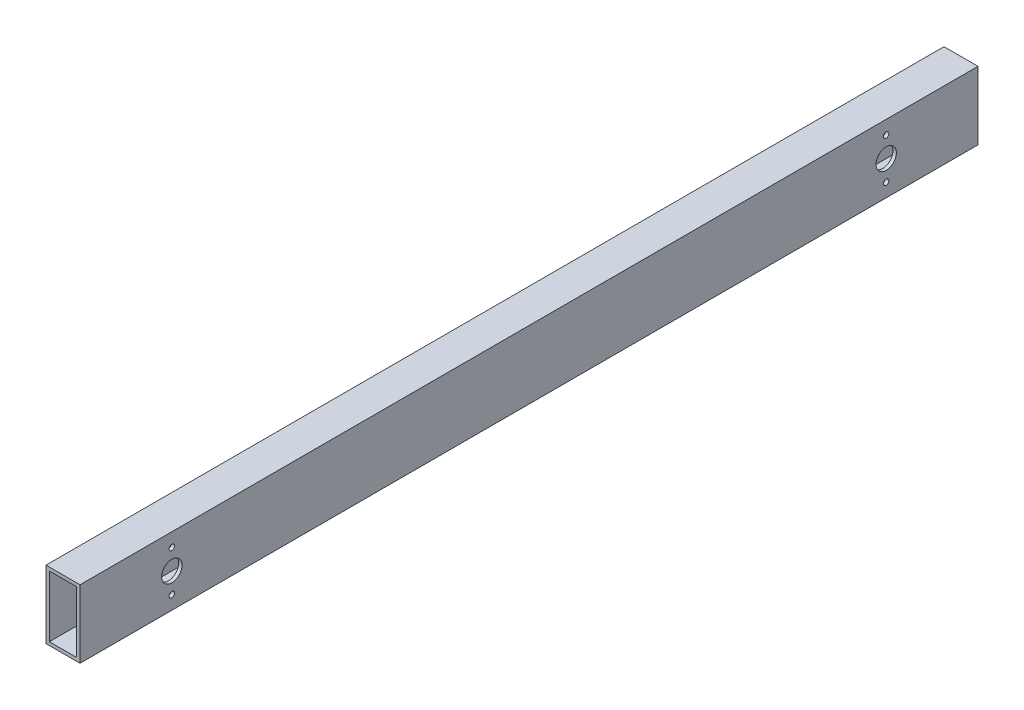
ISO-10303-21;
HEADER;
FILE_DESCRIPTION(('STEP AP214'),'2;1');
FILE_NAME('part.step','',(''),(''),'','','');
FILE_SCHEMA(('AUTOMOTIVE_DESIGN { 1 0 10303 214 1 1 1 1 }'));
ENDSEC;
DATA;
#1=APPLICATION_CONTEXT('core data for automotive mechanical design processes');
#2=APPLICATION_PROTOCOL_DEFINITION('international standard','automotive_design',2000,#1);
#3=PRODUCT_CONTEXT('',#1,'mechanical');
#4=PRODUCT('Part','Part','',(#3));
#5=PRODUCT_RELATED_PRODUCT_CATEGORY('part','',(#4));
#6=PRODUCT_DEFINITION_FORMATION('','',#4);
#7=PRODUCT_DEFINITION_CONTEXT('part definition',#1,'design');
#8=PRODUCT_DEFINITION('design','',#6,#7);
#9=PRODUCT_DEFINITION_SHAPE('','',#8);
#10=(LENGTH_UNIT() NAMED_UNIT(*) SI_UNIT(.MILLI.,.METRE.));
#11=(NAMED_UNIT(*) PLANE_ANGLE_UNIT() SI_UNIT($,.RADIAN.));
#12=(NAMED_UNIT(*) SI_UNIT($,.STERADIAN.) SOLID_ANGLE_UNIT());
#13=UNCERTAINTY_MEASURE_WITH_UNIT(LENGTH_MEASURE(1.E-05),#10,'distance_accuracy_value','');
#14=(GEOMETRIC_REPRESENTATION_CONTEXT(3) GLOBAL_UNCERTAINTY_ASSIGNED_CONTEXT((#13)) GLOBAL_UNIT_ASSIGNED_CONTEXT((#10,
#11,#12)) REPRESENTATION_CONTEXT('',''));
#15=CARTESIAN_POINT('',(0.,0.,0.));
#16=DIRECTION('',(0.,0.,1.));
#17=DIRECTION('',(1.,0.,0.));
#18=AXIS2_PLACEMENT_3D('',#15,#16,#17);
#19=CARTESIAN_POINT('',(-12.1647272806195,2.51031979037716,838.2));
#20=DIRECTION('',(1.,0.,0.));
#21=DIRECTION('',(0.,1.,0.));
#22=AXIS2_PLACEMENT_3D('',#19,#20,#21);
#23=PLANE('',#22);
#24=CARTESIAN_POINT('',(-12.1647272806195,-10.1896802096228,752.475));
#25=DIRECTION('',(1.,0.,0.));
#26=DIRECTION('',(0.,1.,0.));
#27=AXIS2_PLACEMENT_3D('',#24,#25,#26);
#28=CIRCLE('',#27,2.53999999999996);
#29=CARTESIAN_POINT('',(-12.1647272806195,-7.64968020962289,752.475));
#30=VERTEX_POINT('',#29);
#31=EDGE_CURVE('E272',#30,#30,#28,.F.);
#32=ORIENTED_EDGE('',*,*,#31,.F.);
#33=EDGE_LOOP('',(#32));
#34=FACE_BOUND('',#33,.T.);
#35=CARTESIAN_POINT('',(-12.1647272806195,-48.2896802096228,752.475));
#36=DIRECTION('',(1.,0.,0.));
#37=DIRECTION('',(0.,1.,0.));
#38=AXIS2_PLACEMENT_3D('',#35,#36,#37);
#39=CIRCLE('',#38,2.53999999999995);
#40=CARTESIAN_POINT('',(-12.1647272806195,-45.7496802096229,752.475));
#41=VERTEX_POINT('',#40);
#42=EDGE_CURVE('E229',#41,#41,#39,.F.);
#43=ORIENTED_EDGE('',*,*,#42,.F.);
#44=EDGE_LOOP('',(#43));
#45=FACE_BOUND('',#44,.T.);
#46=CARTESIAN_POINT('',(-12.1647272806195,-29.2396802096228,752.475));
#47=DIRECTION('',(1.,0.,0.));
#48=DIRECTION('',(0.,1.,0.));
#49=AXIS2_PLACEMENT_3D('',#46,#47,#48);
#50=CIRCLE('',#49,9.52500000000002);
#51=CARTESIAN_POINT('',(-12.1647272806195,-19.7146802096228,752.475));
#52=VERTEX_POINT('',#51);
#53=EDGE_CURVE('E169',#52,#52,#50,.F.);
#54=ORIENTED_EDGE('',*,*,#53,.F.);
#55=EDGE_LOOP('',(#54));
#56=FACE_BOUND('',#55,.T.);
#57=DIRECTION('',(0.,-1.,0.));
#58=VECTOR('',#57,1.);
#59=CARTESIAN_POINT('',(-12.1647272806195,2.51031979037716,0.));
#60=LINE('',#59,#58);
#61=CARTESIAN_POINT('',(-12.1647272806195,2.51031979037716,0.));
#62=VERTEX_POINT('',#61);
#63=CARTESIAN_POINT('',(-12.1647272806195,-60.9896802096228,0.));
#64=VERTEX_POINT('',#63);
#65=EDGE_CURVE('E117',#62,#64,#60,.T.);
#66=ORIENTED_EDGE('',*,*,#65,.T.);
#67=DIRECTION('',(0.,0.,-1.));
#68=VECTOR('',#67,1.);
#69=CARTESIAN_POINT('',(-12.1647272806195,-60.9896802096228,838.2));
#70=LINE('',#69,#68);
#71=CARTESIAN_POINT('',(-12.1647272806195,-60.9896802096228,838.2));
#72=VERTEX_POINT('',#71);
#73=EDGE_CURVE('E11',#72,#64,#70,.T.);
#74=ORIENTED_EDGE('',*,*,#73,.F.);
#75=DIRECTION('',(0.,-1.,0.));
#76=VECTOR('',#75,1.);
#77=CARTESIAN_POINT('',(-12.1647272806195,2.51031979037716,838.2));
#78=LINE('',#77,#76);
#79=CARTESIAN_POINT('',(-12.1647272806195,2.51031979037716,838.2));
#80=VERTEX_POINT('',#79);
#81=EDGE_CURVE('E140',#80,#72,#78,.T.);
#82=ORIENTED_EDGE('',*,*,#81,.F.);
#83=DIRECTION('',(0.,0.,-1.));
#84=VECTOR('',#83,1.);
#85=CARTESIAN_POINT('',(-12.1647272806195,2.51031979037716,838.2));
#86=LINE('',#85,#84);
#87=EDGE_CURVE('E150',#80,#62,#86,.T.);
#88=ORIENTED_EDGE('',*,*,#87,.T.);
#89=EDGE_LOOP('',(#66,#74,#82,#88));
#90=FACE_BOUND('',#89,.T.);
#91=CARTESIAN_POINT('',(-12.1647272806195,-48.2896802096228,85.7249999999999));
#92=DIRECTION('',(1.,0.,0.));
#93=DIRECTION('',(0.,1.,0.));
#94=AXIS2_PLACEMENT_3D('',#91,#92,#93);
#95=CIRCLE('',#94,2.53999999999995);
#96=CARTESIAN_POINT('',(-12.1647272806195,-45.7496802096228,85.7249999999999));
#97=VERTEX_POINT('',#96);
#98=EDGE_CURVE('E266',#97,#97,#95,.T.);
#99=ORIENTED_EDGE('',*,*,#98,.T.);
#100=EDGE_LOOP('',(#99));
#101=FACE_BOUND('',#100,.T.);
#102=CARTESIAN_POINT('',(-12.1647272806195,-29.2396802096228,85.7249999999999));
#103=DIRECTION('',(1.,0.,0.));
#104=DIRECTION('',(0.,1.,0.));
#105=AXIS2_PLACEMENT_3D('',#102,#103,#104);
#106=CIRCLE('',#105,9.52500000000002);
#107=CARTESIAN_POINT('',(-12.1647272806195,-19.7146802096227,85.7249999999999));
#108=VERTEX_POINT('',#107);
#109=EDGE_CURVE('E240',#108,#108,#106,.T.);
#110=ORIENTED_EDGE('',*,*,#109,.T.);
#111=EDGE_LOOP('',(#110));
#112=FACE_BOUND('',#111,.T.);
#113=CARTESIAN_POINT('',(-12.1647272806195,-10.1896802096228,85.7249999999999));
#114=DIRECTION('',(1.,0.,0.));
#115=DIRECTION('',(0.,1.,0.));
#116=AXIS2_PLACEMENT_3D('',#113,#114,#115);
#117=CIRCLE('',#116,2.53999999999995);
#118=CARTESIAN_POINT('',(-12.1647272806195,-7.64968020962281,85.7249999999999));
#119=VERTEX_POINT('',#118);
#120=EDGE_CURVE('E230',#119,#119,#117,.T.);
#121=ORIENTED_EDGE('',*,*,#120,.T.);
#122=EDGE_LOOP('',(#121));
#123=FACE_BOUND('',#122,.T.);
#124=ADVANCED_FACE('F34',(#34,#45,#56,#90,#101,#112,#123),#23,.F.);
#125=CARTESIAN_POINT('',(19.5852727193805,2.51031979037716,838.2));
#126=DIRECTION('',(-1.,0.,0.));
#127=DIRECTION('',(0.,-1.,0.));
#128=AXIS2_PLACEMENT_3D('',#125,#126,#127);
#129=PLANE('',#128);
#130=CARTESIAN_POINT('',(19.5852727193805,-10.1896802096228,752.475));
#131=DIRECTION('',(1.,0.,0.));
#132=DIRECTION('',(0.,1.,0.));
#133=AXIS2_PLACEMENT_3D('',#130,#131,#132);
#134=CIRCLE('',#133,2.53999999999996);
#135=CARTESIAN_POINT('',(19.5852727193805,-7.64968020962288,752.475));
#136=VERTEX_POINT('',#135);
#137=EDGE_CURVE('E249',#136,#136,#134,.T.);
#138=ORIENTED_EDGE('',*,*,#137,.F.);
#139=EDGE_LOOP('',(#138));
#140=FACE_BOUND('',#139,.T.);
#141=CARTESIAN_POINT('',(19.5852727193805,-48.2896802096228,752.475));
#142=DIRECTION('',(1.,0.,0.));
#143=DIRECTION('',(0.,1.,0.));
#144=AXIS2_PLACEMENT_3D('',#141,#142,#143);
#145=CIRCLE('',#144,2.53999999999995);
#146=CARTESIAN_POINT('',(19.5852727193805,-45.7496802096229,752.475));
#147=VERTEX_POINT('',#146);
#148=EDGE_CURVE('E233',#147,#147,#145,.T.);
#149=ORIENTED_EDGE('',*,*,#148,.F.);
#150=EDGE_LOOP('',(#149));
#151=FACE_BOUND('',#150,.T.);
#152=CARTESIAN_POINT('',(19.5852727193805,-29.2396802096228,752.475));
#153=DIRECTION('',(1.,0.,0.));
#154=DIRECTION('',(0.,1.,0.));
#155=AXIS2_PLACEMENT_3D('',#152,#153,#154);
#156=CIRCLE('',#155,9.52500000000002);
#157=CARTESIAN_POINT('',(19.5852727193805,-19.7146802096228,752.475));
#158=VERTEX_POINT('',#157);
#159=EDGE_CURVE('E246',#158,#158,#156,.T.);
#160=ORIENTED_EDGE('',*,*,#159,.F.);
#161=EDGE_LOOP('',(#160));
#162=FACE_BOUND('',#161,.T.);
#163=DIRECTION('',(0.,1.,0.));
#164=VECTOR('',#163,1.);
#165=CARTESIAN_POINT('',(19.5852727193805,2.51031979037716,0.));
#166=LINE('',#165,#164);
#167=CARTESIAN_POINT('',(19.5852727193805,-60.9896802096228,0.));
#168=VERTEX_POINT('',#167);
#169=CARTESIAN_POINT('',(19.5852727193805,2.51031979037716,0.));
#170=VERTEX_POINT('',#169);
#171=EDGE_CURVE('E155',#168,#170,#166,.T.);
#172=ORIENTED_EDGE('',*,*,#171,.T.);
#173=DIRECTION('',(0.,0.,-1.));
#174=VECTOR('',#173,1.);
#175=CARTESIAN_POINT('',(19.5852727193805,2.51031979037716,838.2));
#176=LINE('',#175,#174);
#177=CARTESIAN_POINT('',(19.5852727193805,2.51031979037716,838.2));
#178=VERTEX_POINT('',#177);
#179=EDGE_CURVE('E160',#178,#170,#176,.T.);
#180=ORIENTED_EDGE('',*,*,#179,.F.);
#181=DIRECTION('',(0.,1.,0.));
#182=VECTOR('',#181,1.);
#183=CARTESIAN_POINT('',(19.5852727193805,2.51031979037716,838.2));
#184=LINE('',#183,#182);
#185=CARTESIAN_POINT('',(19.5852727193805,-60.9896802096228,838.2));
#186=VERTEX_POINT('',#185);
#187=EDGE_CURVE('E146',#186,#178,#184,.T.);
#188=ORIENTED_EDGE('',*,*,#187,.F.);
#189=DIRECTION('',(0.,0.,-1.));
#190=VECTOR('',#189,1.);
#191=CARTESIAN_POINT('',(19.5852727193805,-60.9896802096228,838.2));
#192=LINE('',#191,#190);
#193=EDGE_CURVE('E42',#186,#168,#192,.T.);
#194=ORIENTED_EDGE('',*,*,#193,.T.);
#195=EDGE_LOOP('',(#172,#180,#188,#194));
#196=FACE_BOUND('',#195,.T.);
#197=CARTESIAN_POINT('',(19.5852727193805,-48.2896802096228,85.7249999999999));
#198=DIRECTION('',(-1.,0.,0.));
#199=DIRECTION('',(0.,-1.,0.));
#200=AXIS2_PLACEMENT_3D('',#197,#198,#199);
#201=CIRCLE('',#200,2.53999999999995);
#202=CARTESIAN_POINT('',(19.5852727193805,-50.8296802096227,85.7249999999999));
#203=VERTEX_POINT('',#202);
#204=EDGE_CURVE('E243',#203,#203,#201,.T.);
#205=ORIENTED_EDGE('',*,*,#204,.T.);
#206=EDGE_LOOP('',(#205));
#207=FACE_BOUND('',#206,.T.);
#208=CARTESIAN_POINT('',(19.5852727193805,-29.2396802096228,85.7249999999999));
#209=DIRECTION('',(-1.,0.,0.));
#210=DIRECTION('',(0.,-1.,0.));
#211=AXIS2_PLACEMENT_3D('',#208,#209,#210);
#212=CIRCLE('',#211,9.52500000000002);
#213=CARTESIAN_POINT('',(19.5852727193805,-38.7646802096228,85.7249999999999));
#214=VERTEX_POINT('',#213);
#215=EDGE_CURVE('E236',#214,#214,#212,.T.);
#216=ORIENTED_EDGE('',*,*,#215,.T.);
#217=EDGE_LOOP('',(#216));
#218=FACE_BOUND('',#217,.T.);
#219=CARTESIAN_POINT('',(19.5852727193805,-10.1896802096228,85.7249999999999));
#220=DIRECTION('',(-1.,0.,0.));
#221=DIRECTION('',(0.,-1.,0.));
#222=AXIS2_PLACEMENT_3D('',#219,#220,#221);
#223=CIRCLE('',#222,2.53999999999995);
#224=CARTESIAN_POINT('',(19.5852727193805,-12.7296802096227,85.7249999999999));
#225=VERTEX_POINT('',#224);
#226=EDGE_CURVE('E227',#225,#225,#223,.T.);
#227=ORIENTED_EDGE('',*,*,#226,.T.);
#228=EDGE_LOOP('',(#227));
#229=FACE_BOUND('',#228,.T.);
#230=ADVANCED_FACE('F280',(#140,#151,#162,#196,#207,#218,#229),#129,.F.);
#231=CARTESIAN_POINT('',(-8.98972728061951,-0.664680209622838,838.2));
#232=DIRECTION('',(1.,0.,0.));
#233=DIRECTION('',(0.,1.,0.));
#234=AXIS2_PLACEMENT_3D('',#231,#232,#233);
#235=PLANE('',#234);
#236=CARTESIAN_POINT('',(-8.98972728061951,-10.1896802096228,752.475));
#237=DIRECTION('',(1.,0.,0.));
#238=DIRECTION('',(0.,1.,0.));
#239=AXIS2_PLACEMENT_3D('',#236,#237,#238);
#240=CIRCLE('',#239,2.53999999999996);
#241=CARTESIAN_POINT('',(-8.98972728061951,-7.64968020962289,752.475));
#242=VERTEX_POINT('',#241);
#243=EDGE_CURVE('E130',#242,#242,#240,.T.);
#244=ORIENTED_EDGE('',*,*,#243,.F.);
#245=EDGE_LOOP('',(#244));
#246=FACE_BOUND('',#245,.T.);
#247=CARTESIAN_POINT('',(-8.98972728061951,-48.2896802096228,752.475));
#248=DIRECTION('',(1.,0.,0.));
#249=DIRECTION('',(0.,1.,0.));
#250=AXIS2_PLACEMENT_3D('',#247,#248,#249);
#251=CIRCLE('',#250,2.53999999999995);
#252=CARTESIAN_POINT('',(-8.98972728061951,-45.7496802096229,752.475));
#253=VERTEX_POINT('',#252);
#254=EDGE_CURVE('E183',#253,#253,#251,.T.);
#255=ORIENTED_EDGE('',*,*,#254,.F.);
#256=EDGE_LOOP('',(#255));
#257=FACE_BOUND('',#256,.T.);
#258=CARTESIAN_POINT('',(-8.98972728061951,-29.2396802096228,85.7249999999999));
#259=DIRECTION('',(1.,0.,0.));
#260=DIRECTION('',(0.,1.,0.));
#261=AXIS2_PLACEMENT_3D('',#258,#259,#260);
#262=CIRCLE('',#261,9.52500000000002);
#263=CARTESIAN_POINT('',(-8.98972728061951,-19.7146802096227,85.7249999999999));
#264=VERTEX_POINT('',#263);
#265=EDGE_CURVE('E177',#264,#264,#262,.F.);
#266=ORIENTED_EDGE('',*,*,#265,.T.);
#267=EDGE_LOOP('',(#266));
#268=FACE_BOUND('',#267,.T.);
#269=DIRECTION('',(0.,-1.,0.));
#270=VECTOR('',#269,1.);
#271=CARTESIAN_POINT('',(-8.98972728061951,-0.664680209622838,0.));
#272=LINE('',#271,#270);
#273=CARTESIAN_POINT('',(-8.98972728061951,-0.664680209622838,0.));
#274=VERTEX_POINT('',#273);
#275=CARTESIAN_POINT('',(-8.98972728061951,-57.8146802096228,0.));
#276=VERTEX_POINT('',#275);
#277=EDGE_CURVE('E58',#274,#276,#272,.T.);
#278=ORIENTED_EDGE('',*,*,#277,.F.);
#279=DIRECTION('',(0.,0.,-1.));
#280=VECTOR('',#279,1.);
#281=CARTESIAN_POINT('',(-8.98972728061951,-0.664680209622838,838.2));
#282=LINE('',#281,#280);
#283=CARTESIAN_POINT('',(-8.98972728061951,-0.664680209622838,838.2));
#284=VERTEX_POINT('',#283);
#285=EDGE_CURVE('E105',#284,#274,#282,.T.);
#286=ORIENTED_EDGE('',*,*,#285,.F.);
#287=DIRECTION('',(0.,-1.,0.));
#288=VECTOR('',#287,1.);
#289=CARTESIAN_POINT('',(-8.98972728061951,-0.664680209622838,838.2));
#290=LINE('',#289,#288);
#291=CARTESIAN_POINT('',(-8.98972728061951,-57.8146802096228,838.2));
#292=VERTEX_POINT('',#291);
#293=EDGE_CURVE('E100',#284,#292,#290,.T.);
#294=ORIENTED_EDGE('',*,*,#293,.T.);
#295=DIRECTION('',(0.,0.,-1.));
#296=VECTOR('',#295,1.);
#297=CARTESIAN_POINT('',(-8.98972728061951,-57.8146802096228,838.2));
#298=LINE('',#297,#296);
#299=EDGE_CURVE('E104',#292,#276,#298,.T.);
#300=ORIENTED_EDGE('',*,*,#299,.T.);
#301=EDGE_LOOP('',(#278,#286,#294,#300));
#302=FACE_BOUND('',#301,.T.);
#303=CARTESIAN_POINT('',(-8.98972728061951,-29.2396802096228,752.475));
#304=DIRECTION('',(1.,0.,0.));
#305=DIRECTION('',(0.,1.,0.));
#306=AXIS2_PLACEMENT_3D('',#303,#304,#305);
#307=CIRCLE('',#306,9.52500000000002);
#308=CARTESIAN_POINT('',(-8.98972728061951,-19.7146802096228,752.475));
#309=VERTEX_POINT('',#308);
#310=EDGE_CURVE('E168',#309,#309,#307,.T.);
#311=ORIENTED_EDGE('',*,*,#310,.F.);
#312=EDGE_LOOP('',(#311));
#313=FACE_BOUND('',#312,.T.);
#314=CARTESIAN_POINT('',(-8.98972728061951,-48.2896802096228,85.7249999999999));
#315=DIRECTION('',(1.,0.,0.));
#316=DIRECTION('',(0.,1.,0.));
#317=AXIS2_PLACEMENT_3D('',#314,#315,#316);
#318=CIRCLE('',#317,2.53999999999995);
#319=CARTESIAN_POINT('',(-8.98972728061951,-45.7496802096228,85.7249999999999));
#320=VERTEX_POINT('',#319);
#321=EDGE_CURVE('E173',#320,#320,#318,.F.);
#322=ORIENTED_EDGE('',*,*,#321,.T.);
#323=EDGE_LOOP('',(#322));
#324=FACE_BOUND('',#323,.T.);
#325=CARTESIAN_POINT('',(-8.98972728061951,-10.1896802096228,85.7249999999999));
#326=DIRECTION('',(1.,0.,0.));
#327=DIRECTION('',(0.,1.,0.));
#328=AXIS2_PLACEMENT_3D('',#325,#326,#327);
#329=CIRCLE('',#328,2.53999999999995);
#330=CARTESIAN_POINT('',(-8.98972728061951,-7.64968020962281,85.7249999999999));
#331=VERTEX_POINT('',#330);
#332=EDGE_CURVE('E180',#331,#331,#329,.F.);
#333=ORIENTED_EDGE('',*,*,#332,.T.);
#334=EDGE_LOOP('',(#333));
#335=FACE_BOUND('',#334,.T.);
#336=ADVANCED_FACE('F102',(#246,#257,#268,#302,#313,#324,#335),#235,.T.);
#337=CARTESIAN_POINT('',(16.4102727193805,-0.664680209622838,838.2));
#338=DIRECTION('',(-1.,0.,0.));
#339=DIRECTION('',(0.,-1.,0.));
#340=AXIS2_PLACEMENT_3D('',#337,#338,#339);
#341=PLANE('',#340);
#342=CARTESIAN_POINT('',(16.4102727193805,-10.1896802096228,752.475));
#343=DIRECTION('',(-1.,0.,0.));
#344=DIRECTION('',(0.,-1.,0.));
#345=AXIS2_PLACEMENT_3D('',#342,#343,#344);
#346=CIRCLE('',#345,2.53999999999996);
#347=CARTESIAN_POINT('',(16.4102727193805,-12.7296802096228,752.475));
#348=VERTEX_POINT('',#347);
#349=EDGE_CURVE('E37',#348,#348,#346,.T.);
#350=ORIENTED_EDGE('',*,*,#349,.F.);
#351=EDGE_LOOP('',(#350));
#352=FACE_BOUND('',#351,.T.);
#353=CARTESIAN_POINT('',(16.4102727193805,-48.2896802096228,752.475));
#354=DIRECTION('',(-1.,0.,0.));
#355=DIRECTION('',(0.,-1.,0.));
#356=AXIS2_PLACEMENT_3D('',#353,#354,#355);
#357=CIRCLE('',#356,2.53999999999995);
#358=CARTESIAN_POINT('',(16.4102727193805,-50.8296802096228,752.475));
#359=VERTEX_POINT('',#358);
#360=EDGE_CURVE('E181',#359,#359,#357,.T.);
#361=ORIENTED_EDGE('',*,*,#360,.F.);
#362=EDGE_LOOP('',(#361));
#363=FACE_BOUND('',#362,.T.);
#364=CARTESIAN_POINT('',(16.4102727193805,-29.2396802096228,85.7249999999999));
#365=DIRECTION('',(-1.,0.,0.));
#366=DIRECTION('',(0.,-1.,0.));
#367=AXIS2_PLACEMENT_3D('',#364,#365,#366);
#368=CIRCLE('',#367,9.52500000000002);
#369=CARTESIAN_POINT('',(16.4102727193805,-38.7646802096228,85.7249999999999));
#370=VERTEX_POINT('',#369);
#371=EDGE_CURVE('E174',#370,#370,#368,.F.);
#372=ORIENTED_EDGE('',*,*,#371,.T.);
#373=EDGE_LOOP('',(#372));
#374=FACE_BOUND('',#373,.T.);
#375=DIRECTION('',(0.,1.,0.));
#376=VECTOR('',#375,1.);
#377=CARTESIAN_POINT('',(16.4102727193805,-0.664680209622838,0.));
#378=LINE('',#377,#376);
#379=CARTESIAN_POINT('',(16.4102727193805,-57.8146802096228,0.));
#380=VERTEX_POINT('',#379);
#381=CARTESIAN_POINT('',(16.4102727193805,-0.664680209622838,0.));
#382=VERTEX_POINT('',#381);
#383=EDGE_CURVE('E132',#380,#382,#378,.T.);
#384=ORIENTED_EDGE('',*,*,#383,.F.);
#385=DIRECTION('',(0.,0.,-1.));
#386=VECTOR('',#385,1.);
#387=CARTESIAN_POINT('',(16.4102727193805,-57.8146802096228,838.2));
#388=LINE('',#387,#386);
#389=CARTESIAN_POINT('',(16.4102727193805,-57.8146802096228,838.2));
#390=VERTEX_POINT('',#389);
#391=EDGE_CURVE('E118',#390,#380,#388,.T.);
#392=ORIENTED_EDGE('',*,*,#391,.F.);
#393=DIRECTION('',(0.,1.,0.));
#394=VECTOR('',#393,1.);
#395=CARTESIAN_POINT('',(16.4102727193805,-0.664680209622838,838.2));
#396=LINE('',#395,#394);
#397=CARTESIAN_POINT('',(16.4102727193805,-0.664680209622838,838.2));
#398=VERTEX_POINT('',#397);
#399=EDGE_CURVE('E122',#390,#398,#396,.T.);
#400=ORIENTED_EDGE('',*,*,#399,.T.);
#401=DIRECTION('',(0.,0.,-1.));
#402=VECTOR('',#401,1.);
#403=CARTESIAN_POINT('',(16.4102727193805,-0.664680209622838,838.2));
#404=LINE('',#403,#402);
#405=EDGE_CURVE('E50',#398,#382,#404,.T.);
#406=ORIENTED_EDGE('',*,*,#405,.T.);
#407=EDGE_LOOP('',(#384,#392,#400,#406));
#408=FACE_BOUND('',#407,.T.);
#409=CARTESIAN_POINT('',(16.4102727193805,-29.2396802096228,752.475));
#410=DIRECTION('',(-1.,0.,0.));
#411=DIRECTION('',(0.,-1.,0.));
#412=AXIS2_PLACEMENT_3D('',#409,#410,#411);
#413=CIRCLE('',#412,9.52500000000002);
#414=CARTESIAN_POINT('',(16.4102727193805,-38.7646802096229,752.475));
#415=VERTEX_POINT('',#414);
#416=EDGE_CURVE('E165',#415,#415,#413,.T.);
#417=ORIENTED_EDGE('',*,*,#416,.F.);
#418=EDGE_LOOP('',(#417));
#419=FACE_BOUND('',#418,.T.);
#420=CARTESIAN_POINT('',(16.4102727193805,-48.2896802096228,85.7249999999999));
#421=DIRECTION('',(-1.,0.,0.));
#422=DIRECTION('',(0.,-1.,0.));
#423=AXIS2_PLACEMENT_3D('',#420,#421,#422);
#424=CIRCLE('',#423,2.53999999999995);
#425=CARTESIAN_POINT('',(16.4102727193805,-50.8296802096227,85.7249999999999));
#426=VERTEX_POINT('',#425);
#427=EDGE_CURVE('E170',#426,#426,#424,.F.);
#428=ORIENTED_EDGE('',*,*,#427,.T.);
#429=EDGE_LOOP('',(#428));
#430=FACE_BOUND('',#429,.T.);
#431=CARTESIAN_POINT('',(16.4102727193805,-10.1896802096228,85.7249999999999));
#432=DIRECTION('',(-1.,0.,0.));
#433=DIRECTION('',(0.,-1.,0.));
#434=AXIS2_PLACEMENT_3D('',#431,#432,#433);
#435=CIRCLE('',#434,2.53999999999995);
#436=CARTESIAN_POINT('',(16.4102727193805,-12.7296802096227,85.7249999999999));
#437=VERTEX_POINT('',#436);
#438=EDGE_CURVE('E178',#437,#437,#435,.F.);
#439=ORIENTED_EDGE('',*,*,#438,.T.);
#440=EDGE_LOOP('',(#439));
#441=FACE_BOUND('',#440,.T.);
#442=ADVANCED_FACE('F203',(#352,#363,#374,#408,#419,#430,#441),#341,.T.);
#443=CARTESIAN_POINT('',(0.,0.,838.2));
#444=DIRECTION('',(0.,0.,1.));
#445=DIRECTION('',(1.,0.,0.));
#446=AXIS2_PLACEMENT_3D('',#443,#444,#445);
#447=PLANE('',#446);
#448=ORIENTED_EDGE('',*,*,#81,.T.);
#449=DIRECTION('',(1.,0.,0.));
#450=VECTOR('',#449,1.);
#451=CARTESIAN_POINT('',(-12.1647272806195,-60.9896802096228,838.2));
#452=LINE('',#451,#450);
#453=EDGE_CURVE('E143',#72,#186,#452,.T.);
#454=ORIENTED_EDGE('',*,*,#453,.T.);
#455=ORIENTED_EDGE('',*,*,#187,.T.);
#456=DIRECTION('',(-1.,0.,0.));
#457=VECTOR('',#456,1.);
#458=CARTESIAN_POINT('',(-12.1647272806195,2.51031979037716,838.2));
#459=LINE('',#458,#457);
#460=EDGE_CURVE('E148',#178,#80,#459,.T.);
#461=ORIENTED_EDGE('',*,*,#460,.T.);
#462=EDGE_LOOP('',(#448,#454,#455,#461));
#463=FACE_BOUND('',#462,.T.);
#464=DIRECTION('',(1.,0.,0.));
#465=VECTOR('',#464,1.);
#466=CARTESIAN_POINT('',(-8.98972728061951,-57.8146802096228,838.2));
#467=LINE('',#466,#465);
#468=EDGE_CURVE('E109',#292,#390,#467,.T.);
#469=ORIENTED_EDGE('',*,*,#468,.F.);
#470=ORIENTED_EDGE('',*,*,#293,.F.);
#471=DIRECTION('',(-1.,0.,0.));
#472=VECTOR('',#471,1.);
#473=CARTESIAN_POINT('',(-8.98972728061951,-0.664680209622838,838.2));
#474=LINE('',#473,#472);
#475=EDGE_CURVE('E124',#398,#284,#474,.T.);
#476=ORIENTED_EDGE('',*,*,#475,.F.);
#477=ORIENTED_EDGE('',*,*,#399,.F.);
#478=EDGE_LOOP('',(#469,#470,#476,#477));
#479=FACE_BOUND('',#478,.T.);
#480=ADVANCED_FACE('F121',(#463,#479),#447,.T.);
#481=CARTESIAN_POINT('',(0.,0.,0.));
#482=DIRECTION('',(0.,0.,1.));
#483=DIRECTION('',(1.,0.,0.));
#484=AXIS2_PLACEMENT_3D('',#481,#482,#483);
#485=PLANE('',#484);
#486=ORIENTED_EDGE('',*,*,#65,.F.);
#487=DIRECTION('',(-1.,0.,0.));
#488=VECTOR('',#487,1.);
#489=CARTESIAN_POINT('',(-12.1647272806195,2.51031979037716,0.));
#490=LINE('',#489,#488);
#491=EDGE_CURVE('E144',#170,#62,#490,.T.);
#492=ORIENTED_EDGE('',*,*,#491,.F.);
#493=ORIENTED_EDGE('',*,*,#171,.F.);
#494=DIRECTION('',(1.,0.,0.));
#495=VECTOR('',#494,1.);
#496=CARTESIAN_POINT('',(-12.1647272806195,-60.9896802096228,0.));
#497=LINE('',#496,#495);
#498=EDGE_CURVE('E153',#64,#168,#497,.T.);
#499=ORIENTED_EDGE('',*,*,#498,.F.);
#500=EDGE_LOOP('',(#486,#492,#493,#499));
#501=FACE_BOUND('',#500,.T.);
#502=ORIENTED_EDGE('',*,*,#277,.T.);
#503=DIRECTION('',(1.,0.,0.));
#504=VECTOR('',#503,1.);
#505=CARTESIAN_POINT('',(-8.98972728061951,-57.8146802096228,0.));
#506=LINE('',#505,#504);
#507=EDGE_CURVE('E116',#276,#380,#506,.T.);
#508=ORIENTED_EDGE('',*,*,#507,.T.);
#509=ORIENTED_EDGE('',*,*,#383,.T.);
#510=DIRECTION('',(-1.,0.,0.));
#511=VECTOR('',#510,1.);
#512=CARTESIAN_POINT('',(-8.98972728061951,-0.664680209622838,0.));
#513=LINE('',#512,#511);
#514=EDGE_CURVE('E110',#382,#274,#513,.T.);
#515=ORIENTED_EDGE('',*,*,#514,.T.);
#516=EDGE_LOOP('',(#502,#508,#509,#515));
#517=FACE_BOUND('',#516,.T.);
#518=ADVANCED_FACE('F465',(#501,#517),#485,.F.);
#519=CARTESIAN_POINT('',(-12.1647272806195,-60.9896802096228,838.2));
#520=DIRECTION('',(0.,1.,0.));
#521=DIRECTION('',(0.,0.,1.));
#522=AXIS2_PLACEMENT_3D('',#519,#520,#521);
#523=PLANE('',#522);
#524=ORIENTED_EDGE('',*,*,#498,.T.);
#525=ORIENTED_EDGE('',*,*,#193,.F.);
#526=ORIENTED_EDGE('',*,*,#453,.F.);
#527=ORIENTED_EDGE('',*,*,#73,.T.);
#528=EDGE_LOOP('',(#524,#525,#526,#527));
#529=FACE_BOUND('',#528,.T.);
#530=ADVANCED_FACE('F455',(#529),#523,.F.);
#531=CARTESIAN_POINT('',(-12.1647272806195,2.51031979037716,838.2));
#532=DIRECTION('',(0.,-1.,0.));
#533=DIRECTION('',(1.,0.,0.));
#534=AXIS2_PLACEMENT_3D('',#531,#532,#533);
#535=PLANE('',#534);
#536=ORIENTED_EDGE('',*,*,#491,.T.);
#537=ORIENTED_EDGE('',*,*,#87,.F.);
#538=ORIENTED_EDGE('',*,*,#460,.F.);
#539=ORIENTED_EDGE('',*,*,#179,.T.);
#540=EDGE_LOOP('',(#536,#537,#538,#539));
#541=FACE_BOUND('',#540,.T.);
#542=ADVANCED_FACE('F446',(#541),#535,.F.);
#543=CARTESIAN_POINT('',(-8.98972728061951,-57.8146802096228,838.2));
#544=DIRECTION('',(0.,1.,0.));
#545=DIRECTION('',(0.,0.,1.));
#546=AXIS2_PLACEMENT_3D('',#543,#544,#545);
#547=PLANE('',#546);
#548=ORIENTED_EDGE('',*,*,#507,.F.);
#549=ORIENTED_EDGE('',*,*,#299,.F.);
#550=ORIENTED_EDGE('',*,*,#468,.T.);
#551=ORIENTED_EDGE('',*,*,#391,.T.);
#552=EDGE_LOOP('',(#548,#549,#550,#551));
#553=FACE_BOUND('',#552,.T.);
#554=ADVANCED_FACE('F113',(#553),#547,.T.);
#555=CARTESIAN_POINT('',(-8.98972728061951,-0.664680209622838,838.2));
#556=DIRECTION('',(0.,-1.,0.));
#557=DIRECTION('',(0.,0.,-1.));
#558=AXIS2_PLACEMENT_3D('',#555,#556,#557);
#559=PLANE('',#558);
#560=ORIENTED_EDGE('',*,*,#514,.F.);
#561=ORIENTED_EDGE('',*,*,#405,.F.);
#562=ORIENTED_EDGE('',*,*,#475,.T.);
#563=ORIENTED_EDGE('',*,*,#285,.T.);
#564=EDGE_LOOP('',(#560,#561,#562,#563));
#565=FACE_BOUND('',#564,.T.);
#566=ADVANCED_FACE('F403',(#565),#559,.T.);
#567=CARTESIAN_POINT('',(-39.105495643827,-29.2396802096228,752.475));
#568=DIRECTION('',(1.,0.,0.));
#569=DIRECTION('',(0.,1.,0.));
#570=AXIS2_PLACEMENT_3D('',#567,#568,#569);
#571=CYLINDRICAL_SURFACE('',#570,9.52500000000002);
#572=ORIENTED_EDGE('',*,*,#416,.T.);
#573=EDGE_LOOP('',(#572));
#574=FACE_BOUND('',#573,.T.);
#575=ORIENTED_EDGE('',*,*,#159,.T.);
#576=EDGE_LOOP('',(#575));
#577=FACE_BOUND('',#576,.T.);
#578=ADVANCED_FACE('F300',(#574,#577),#571,.F.);
#579=CARTESIAN_POINT('',(-39.105495643827,-48.2896802096228,85.7249999999999));
#580=DIRECTION('',(1.,0.,0.));
#581=DIRECTION('',(0.,1.,0.));
#582=AXIS2_PLACEMENT_3D('',#579,#580,#581);
#583=CYLINDRICAL_SURFACE('',#582,2.53999999999995);
#584=ORIENTED_EDGE('',*,*,#427,.F.);
#585=EDGE_LOOP('',(#584));
#586=FACE_BOUND('',#585,.T.);
#587=ORIENTED_EDGE('',*,*,#204,.F.);
#588=EDGE_LOOP('',(#587));
#589=FACE_BOUND('',#588,.T.);
#590=ADVANCED_FACE('F263',(#586,#589),#583,.F.);
#591=CARTESIAN_POINT('',(-39.105495643827,-29.2396802096228,85.7249999999999));
#592=DIRECTION('',(1.,0.,0.));
#593=DIRECTION('',(0.,1.,0.));
#594=AXIS2_PLACEMENT_3D('',#591,#592,#593);
#595=CYLINDRICAL_SURFACE('',#594,9.52500000000002);
#596=ORIENTED_EDGE('',*,*,#371,.F.);
#597=EDGE_LOOP('',(#596));
#598=FACE_BOUND('',#597,.T.);
#599=ORIENTED_EDGE('',*,*,#215,.F.);
#600=EDGE_LOOP('',(#599));
#601=FACE_BOUND('',#600,.T.);
#602=ADVANCED_FACE('F222',(#598,#601),#595,.F.);
#603=CARTESIAN_POINT('',(-39.105495643827,-10.1896802096228,85.7249999999999));
#604=DIRECTION('',(1.,0.,0.));
#605=DIRECTION('',(0.,1.,0.));
#606=AXIS2_PLACEMENT_3D('',#603,#604,#605);
#607=CYLINDRICAL_SURFACE('',#606,2.53999999999995);
#608=ORIENTED_EDGE('',*,*,#438,.F.);
#609=EDGE_LOOP('',(#608));
#610=FACE_BOUND('',#609,.T.);
#611=ORIENTED_EDGE('',*,*,#226,.F.);
#612=EDGE_LOOP('',(#611));
#613=FACE_BOUND('',#612,.T.);
#614=ADVANCED_FACE('F218',(#610,#613),#607,.F.);
#615=CARTESIAN_POINT('',(-39.105495643827,-48.2896802096228,752.475));
#616=DIRECTION('',(1.,0.,0.));
#617=DIRECTION('',(0.,1.,0.));
#618=AXIS2_PLACEMENT_3D('',#615,#616,#617);
#619=CYLINDRICAL_SURFACE('',#618,2.53999999999995);
#620=ORIENTED_EDGE('',*,*,#360,.T.);
#621=EDGE_LOOP('',(#620));
#622=FACE_BOUND('',#621,.T.);
#623=ORIENTED_EDGE('',*,*,#148,.T.);
#624=EDGE_LOOP('',(#623));
#625=FACE_BOUND('',#624,.T.);
#626=ADVANCED_FACE('F221',(#622,#625),#619,.F.);
#627=CARTESIAN_POINT('',(-39.105495643827,-10.1896802096228,752.475));
#628=DIRECTION('',(1.,0.,0.));
#629=DIRECTION('',(0.,1.,0.));
#630=AXIS2_PLACEMENT_3D('',#627,#628,#629);
#631=CYLINDRICAL_SURFACE('',#630,2.53999999999996);
#632=ORIENTED_EDGE('',*,*,#349,.T.);
#633=EDGE_LOOP('',(#632));
#634=FACE_BOUND('',#633,.T.);
#635=ORIENTED_EDGE('',*,*,#137,.T.);
#636=EDGE_LOOP('',(#635));
#637=FACE_BOUND('',#636,.T.);
#638=ADVANCED_FACE('F200',(#634,#637),#631,.F.);
#639=ORIENTED_EDGE('',*,*,#310,.T.);
#640=EDGE_LOOP('',(#639));
#641=FACE_BOUND('',#640,.T.);
#642=ORIENTED_EDGE('',*,*,#53,.T.);
#643=EDGE_LOOP('',(#642));
#644=FACE_BOUND('',#643,.T.);
#645=ADVANCED_FACE('F261',(#641,#644),#571,.F.);
#646=ORIENTED_EDGE('',*,*,#321,.F.);
#647=EDGE_LOOP('',(#646));
#648=FACE_BOUND('',#647,.T.);
#649=ORIENTED_EDGE('',*,*,#98,.F.);
#650=EDGE_LOOP('',(#649));
#651=FACE_BOUND('',#650,.T.);
#652=ADVANCED_FACE('F257',(#648,#651),#583,.F.);
#653=ORIENTED_EDGE('',*,*,#265,.F.);
#654=EDGE_LOOP('',(#653));
#655=FACE_BOUND('',#654,.T.);
#656=ORIENTED_EDGE('',*,*,#109,.F.);
#657=EDGE_LOOP('',(#656));
#658=FACE_BOUND('',#657,.T.);
#659=ADVANCED_FACE('F260',(#655,#658),#595,.F.);
#660=ORIENTED_EDGE('',*,*,#332,.F.);
#661=EDGE_LOOP('',(#660));
#662=FACE_BOUND('',#661,.T.);
#663=ORIENTED_EDGE('',*,*,#120,.F.);
#664=EDGE_LOOP('',(#663));
#665=FACE_BOUND('',#664,.T.);
#666=ADVANCED_FACE('F224',(#662,#665),#607,.F.);
#667=ORIENTED_EDGE('',*,*,#254,.T.);
#668=EDGE_LOOP('',(#667));
#669=FACE_BOUND('',#668,.T.);
#670=ORIENTED_EDGE('',*,*,#42,.T.);
#671=EDGE_LOOP('',(#670));
#672=FACE_BOUND('',#671,.T.);
#673=ADVANCED_FACE('F323',(#669,#672),#619,.F.);
#674=ORIENTED_EDGE('',*,*,#243,.T.);
#675=EDGE_LOOP('',(#674));
#676=FACE_BOUND('',#675,.T.);
#677=ORIENTED_EDGE('',*,*,#31,.T.);
#678=EDGE_LOOP('',(#677));
#679=FACE_BOUND('',#678,.T.);
#680=ADVANCED_FACE('F328',(#676,#679),#631,.F.);
#681=CLOSED_SHELL('',(#124,#230,#336,#442,#480,#518,#530,#542,#554,#566,#578,#590,#602,#614,
#626,#638,#645,#652,#659,#666,#673,#680));
#682=MANIFOLD_SOLID_BREP('B2',#681);
#683=ADVANCED_BREP_SHAPE_REPRESENTATION('',(#18,#682),#14);
#684=SHAPE_DEFINITION_REPRESENTATION(#9,#683);
ENDSEC;
END-ISO-10303-21;
